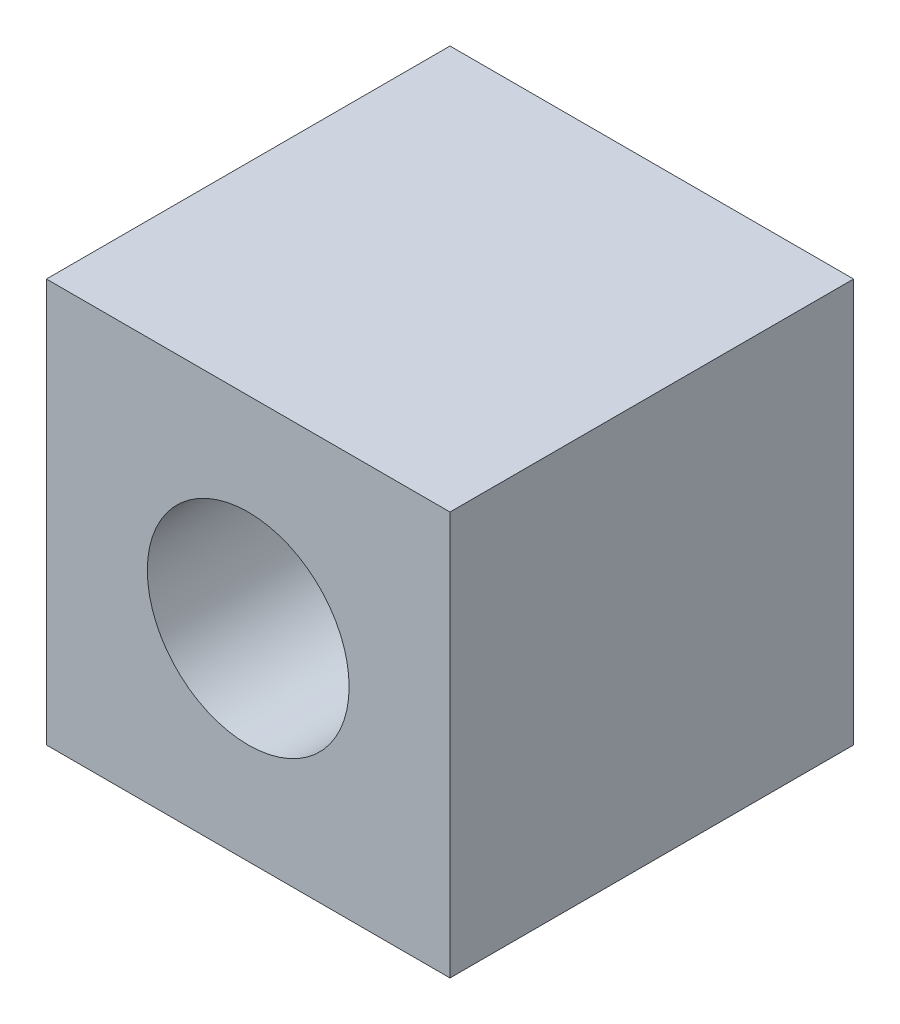
ISO-10303-21;
HEADER;
FILE_DESCRIPTION(('STEP AP214'),'2;1');
FILE_NAME('part.step','',(''),(''),'','','');
FILE_SCHEMA(('AUTOMOTIVE_DESIGN { 1 0 10303 214 1 1 1 1 }'));
ENDSEC;
DATA;
#1=APPLICATION_CONTEXT('core data for automotive mechanical design processes');
#2=APPLICATION_PROTOCOL_DEFINITION('international standard','automotive_design',2000,#1);
#3=PRODUCT_CONTEXT('',#1,'mechanical');
#4=PRODUCT('Part','Part','',(#3));
#5=PRODUCT_RELATED_PRODUCT_CATEGORY('part','',(#4));
#6=PRODUCT_DEFINITION_FORMATION('','',#4);
#7=PRODUCT_DEFINITION_CONTEXT('part definition',#1,'design');
#8=PRODUCT_DEFINITION('design','',#6,#7);
#9=PRODUCT_DEFINITION_SHAPE('','',#8);
#10=(LENGTH_UNIT() NAMED_UNIT(*) SI_UNIT(.MILLI.,.METRE.));
#11=(NAMED_UNIT(*) PLANE_ANGLE_UNIT() SI_UNIT($,.RADIAN.));
#12=(NAMED_UNIT(*) SI_UNIT($,.STERADIAN.) SOLID_ANGLE_UNIT());
#13=UNCERTAINTY_MEASURE_WITH_UNIT(LENGTH_MEASURE(1.E-05),#10,'distance_accuracy_value','');
#14=(GEOMETRIC_REPRESENTATION_CONTEXT(3) GLOBAL_UNCERTAINTY_ASSIGNED_CONTEXT((#13)) GLOBAL_UNIT_ASSIGNED_CONTEXT((#10,
#11,#12)) REPRESENTATION_CONTEXT('',''));
#15=CARTESIAN_POINT('',(0.,0.,0.));
#16=DIRECTION('',(0.,0.,1.));
#17=DIRECTION('',(1.,0.,0.));
#18=AXIS2_PLACEMENT_3D('',#15,#16,#17);
#19=CARTESIAN_POINT('',(0.,0.,10.));
#20=DIRECTION('',(1.,0.,0.));
#21=DIRECTION('',(0.,0.,-1.));
#22=AXIS2_PLACEMENT_3D('',#19,#20,#21);
#23=PLANE('',#22);
#24=DIRECTION('',(0.,-1.,0.));
#25=VECTOR('',#24,1.);
#26=CARTESIAN_POINT('',(0.,0.,0.));
#27=LINE('',#26,#25);
#28=CARTESIAN_POINT('',(0.,10.,0.));
#29=VERTEX_POINT('',#28);
#30=CARTESIAN_POINT('',(0.,0.,0.));
#31=VERTEX_POINT('',#30);
#32=EDGE_CURVE('E98',#29,#31,#27,.T.);
#33=ORIENTED_EDGE('',*,*,#32,.T.);
#34=DIRECTION('',(0.,0.,-1.));
#35=VECTOR('',#34,1.);
#36=CARTESIAN_POINT('',(0.,0.,10.));
#37=LINE('',#36,#35);
#38=CARTESIAN_POINT('',(0.,0.,10.));
#39=VERTEX_POINT('',#38);
#40=EDGE_CURVE('E11',#39,#31,#37,.T.);
#41=ORIENTED_EDGE('',*,*,#40,.F.);
#42=DIRECTION('',(0.,-1.,0.));
#43=VECTOR('',#42,1.);
#44=CARTESIAN_POINT('',(0.,0.,10.));
#45=LINE('',#44,#43);
#46=CARTESIAN_POINT('',(0.,10.,10.));
#47=VERTEX_POINT('',#46);
#48=EDGE_CURVE('E86',#47,#39,#45,.T.);
#49=ORIENTED_EDGE('',*,*,#48,.F.);
#50=DIRECTION('',(0.,0.,-1.));
#51=VECTOR('',#50,1.);
#52=CARTESIAN_POINT('',(0.,10.,10.));
#53=LINE('',#52,#51);
#54=EDGE_CURVE('E94',#47,#29,#53,.T.);
#55=ORIENTED_EDGE('',*,*,#54,.T.);
#56=EDGE_LOOP('',(#33,#41,#49,#55));
#57=FACE_BOUND('',#56,.T.);
#58=ADVANCED_FACE('F35',(#57),#23,.F.);
#59=CARTESIAN_POINT('',(0.,0.,10.));
#60=DIRECTION('',(0.,1.,0.));
#61=DIRECTION('',(0.,0.,1.));
#62=AXIS2_PLACEMENT_3D('',#59,#60,#61);
#63=PLANE('',#62);
#64=DIRECTION('',(1.,0.,0.));
#65=VECTOR('',#64,1.);
#66=CARTESIAN_POINT('',(0.,0.,0.));
#67=LINE('',#66,#65);
#68=CARTESIAN_POINT('',(10.,0.,0.));
#69=VERTEX_POINT('',#68);
#70=EDGE_CURVE('E90',#31,#69,#67,.T.);
#71=ORIENTED_EDGE('',*,*,#70,.T.);
#72=DIRECTION('',(0.,0.,-1.));
#73=VECTOR('',#72,1.);
#74=CARTESIAN_POINT('',(10.,0.,10.));
#75=LINE('',#74,#73);
#76=CARTESIAN_POINT('',(10.,0.,10.));
#77=VERTEX_POINT('',#76);
#78=EDGE_CURVE('E43',#77,#69,#75,.T.);
#79=ORIENTED_EDGE('',*,*,#78,.F.);
#80=DIRECTION('',(1.,0.,0.));
#81=VECTOR('',#80,1.);
#82=CARTESIAN_POINT('',(0.,0.,10.));
#83=LINE('',#82,#81);
#84=EDGE_CURVE('E81',#39,#77,#83,.T.);
#85=ORIENTED_EDGE('',*,*,#84,.F.);
#86=ORIENTED_EDGE('',*,*,#40,.T.);
#87=EDGE_LOOP('',(#71,#79,#85,#86));
#88=FACE_BOUND('',#87,.T.);
#89=ADVANCED_FACE('F89',(#88),#63,.F.);
#90=CARTESIAN_POINT('',(10.,0.,10.));
#91=DIRECTION('',(-1.,0.,0.));
#92=DIRECTION('',(0.,0.,1.));
#93=AXIS2_PLACEMENT_3D('',#90,#91,#92);
#94=PLANE('',#93);
#95=DIRECTION('',(0.,1.,0.));
#96=VECTOR('',#95,1.);
#97=CARTESIAN_POINT('',(10.,0.,0.));
#98=LINE('',#97,#96);
#99=CARTESIAN_POINT('',(10.,10.,0.));
#100=VERTEX_POINT('',#99);
#101=EDGE_CURVE('E68',#69,#100,#98,.T.);
#102=ORIENTED_EDGE('',*,*,#101,.T.);
#103=DIRECTION('',(0.,0.,-1.));
#104=VECTOR('',#103,1.);
#105=CARTESIAN_POINT('',(10.,10.,10.));
#106=LINE('',#105,#104);
#107=CARTESIAN_POINT('',(10.,10.,10.));
#108=VERTEX_POINT('',#107);
#109=EDGE_CURVE('E91',#108,#100,#106,.T.);
#110=ORIENTED_EDGE('',*,*,#109,.F.);
#111=DIRECTION('',(0.,1.,0.));
#112=VECTOR('',#111,1.);
#113=CARTESIAN_POINT('',(10.,0.,10.));
#114=LINE('',#113,#112);
#115=EDGE_CURVE('E84',#77,#108,#114,.T.);
#116=ORIENTED_EDGE('',*,*,#115,.F.);
#117=ORIENTED_EDGE('',*,*,#78,.T.);
#118=EDGE_LOOP('',(#102,#110,#116,#117));
#119=FACE_BOUND('',#118,.T.);
#120=ADVANCED_FACE('F92',(#119),#94,.F.);
#121=CARTESIAN_POINT('',(0.,10.,10.));
#122=DIRECTION('',(0.,-1.,0.));
#123=DIRECTION('',(0.,0.,-1.));
#124=AXIS2_PLACEMENT_3D('',#121,#122,#123);
#125=PLANE('',#124);
#126=DIRECTION('',(-1.,0.,0.));
#127=VECTOR('',#126,1.);
#128=CARTESIAN_POINT('',(0.,10.,0.));
#129=LINE('',#128,#127);
#130=EDGE_CURVE('E74',#100,#29,#129,.T.);
#131=ORIENTED_EDGE('',*,*,#130,.T.);
#132=ORIENTED_EDGE('',*,*,#54,.F.);
#133=DIRECTION('',(-1.,0.,0.));
#134=VECTOR('',#133,1.);
#135=CARTESIAN_POINT('',(0.,10.,10.));
#136=LINE('',#135,#134);
#137=EDGE_CURVE('E51',#108,#47,#136,.T.);
#138=ORIENTED_EDGE('',*,*,#137,.F.);
#139=ORIENTED_EDGE('',*,*,#109,.T.);
#140=EDGE_LOOP('',(#131,#132,#138,#139));
#141=FACE_BOUND('',#140,.T.);
#142=ADVANCED_FACE('F106',(#141),#125,.F.);
#143=CARTESIAN_POINT('',(0.,0.,10.));
#144=DIRECTION('',(0.,0.,-1.));
#145=DIRECTION('',(-1.,0.,0.));
#146=AXIS2_PLACEMENT_3D('',#143,#144,#145);
#147=PLANE('',#146);
#148=CARTESIAN_POINT('',(5.,5.,10.));
#149=DIRECTION('',(0.,0.,1.));
#150=DIRECTION('',(1.,0.,0.));
#151=AXIS2_PLACEMENT_3D('',#148,#149,#150);
#152=CIRCLE('',#151,2.5);
#153=CARTESIAN_POINT('',(7.5,5.,10.));
#154=VERTEX_POINT('',#153);
#155=EDGE_CURVE('E112',#154,#154,#152,.T.);
#156=ORIENTED_EDGE('',*,*,#155,.F.);
#157=EDGE_LOOP('',(#156));
#158=FACE_BOUND('',#157,.T.);
#159=ORIENTED_EDGE('',*,*,#48,.T.);
#160=ORIENTED_EDGE('',*,*,#84,.T.);
#161=ORIENTED_EDGE('',*,*,#115,.T.);
#162=ORIENTED_EDGE('',*,*,#137,.T.);
#163=EDGE_LOOP('',(#159,#160,#161,#162));
#164=FACE_BOUND('',#163,.T.);
#165=ADVANCED_FACE('F82',(#158,#164),#147,.F.);
#166=CARTESIAN_POINT('',(0.,0.,0.));
#167=DIRECTION('',(0.,0.,-1.));
#168=DIRECTION('',(-1.,0.,0.));
#169=AXIS2_PLACEMENT_3D('',#166,#167,#168);
#170=PLANE('',#169);
#171=CARTESIAN_POINT('',(5.,5.,0.));
#172=DIRECTION('',(0.,0.,1.));
#173=DIRECTION('',(1.,0.,0.));
#174=AXIS2_PLACEMENT_3D('',#171,#172,#173);
#175=CIRCLE('',#174,2.5);
#176=CARTESIAN_POINT('',(7.5,5.,0.));
#177=VERTEX_POINT('',#176);
#178=EDGE_CURVE('E101',#177,#177,#175,.T.);
#179=ORIENTED_EDGE('',*,*,#178,.T.);
#180=EDGE_LOOP('',(#179));
#181=FACE_BOUND('',#180,.T.);
#182=ORIENTED_EDGE('',*,*,#32,.F.);
#183=ORIENTED_EDGE('',*,*,#130,.F.);
#184=ORIENTED_EDGE('',*,*,#101,.F.);
#185=ORIENTED_EDGE('',*,*,#70,.F.);
#186=EDGE_LOOP('',(#182,#183,#184,#185));
#187=FACE_BOUND('',#186,.T.);
#188=ADVANCED_FACE('F109',(#181,#187),#170,.T.);
#189=CARTESIAN_POINT('',(5.,5.,0.));
#190=DIRECTION('',(0.,0.,1.));
#191=DIRECTION('',(1.,0.,0.));
#192=AXIS2_PLACEMENT_3D('',#189,#190,#191);
#193=CYLINDRICAL_SURFACE('',#192,2.5);
#194=ORIENTED_EDGE('',*,*,#178,.F.);
#195=EDGE_LOOP('',(#194));
#196=FACE_BOUND('',#195,.T.);
#197=ORIENTED_EDGE('',*,*,#155,.T.);
#198=EDGE_LOOP('',(#197));
#199=FACE_BOUND('',#198,.T.);
#200=ADVANCED_FACE('F119',(#196,#199),#193,.F.);
#201=CLOSED_SHELL('',(#58,#89,#120,#142,#165,#188,#200));
#202=MANIFOLD_SOLID_BREP('B2',#201);
#203=ADVANCED_BREP_SHAPE_REPRESENTATION('',(#18,#202),#14);
#204=SHAPE_DEFINITION_REPRESENTATION(#9,#203);
ENDSEC;
END-ISO-10303-21;
